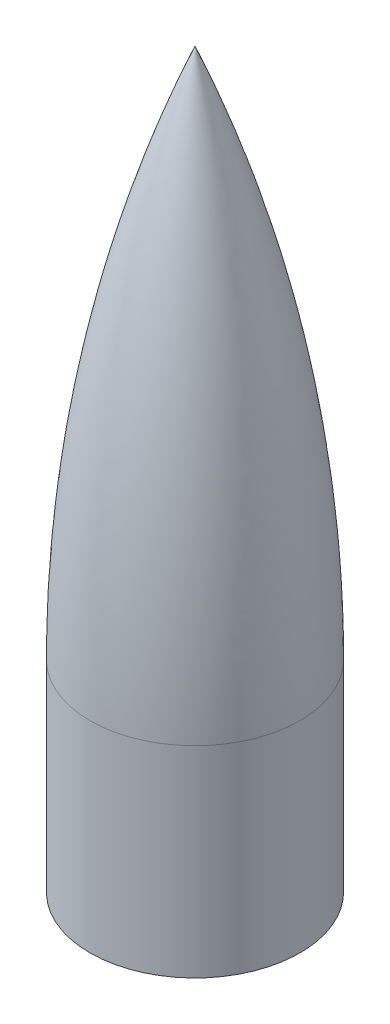
ISO-10303-21;
HEADER;
FILE_DESCRIPTION(('STEP AP214'),'2;1');
FILE_NAME('part.step','',(''),(''),'','','');
FILE_SCHEMA(('AUTOMOTIVE_DESIGN { 1 0 10303 214 1 1 1 1 }'));
ENDSEC;
DATA;
#1=APPLICATION_CONTEXT('core data for automotive mechanical design processes');
#2=APPLICATION_PROTOCOL_DEFINITION('international standard','automotive_design',2000,#1);
#3=PRODUCT_CONTEXT('',#1,'mechanical');
#4=PRODUCT('Part','Part','',(#3));
#5=PRODUCT_RELATED_PRODUCT_CATEGORY('part','',(#4));
#6=PRODUCT_DEFINITION_FORMATION('','',#4);
#7=PRODUCT_DEFINITION_CONTEXT('part definition',#1,'design');
#8=PRODUCT_DEFINITION('design','',#6,#7);
#9=PRODUCT_DEFINITION_SHAPE('','',#8);
#10=(LENGTH_UNIT() NAMED_UNIT(*) SI_UNIT(.MILLI.,.METRE.));
#11=(NAMED_UNIT(*) PLANE_ANGLE_UNIT() SI_UNIT($,.RADIAN.));
#12=(NAMED_UNIT(*) SI_UNIT($,.STERADIAN.) SOLID_ANGLE_UNIT());
#13=UNCERTAINTY_MEASURE_WITH_UNIT(LENGTH_MEASURE(1.E-05),#10,'distance_accuracy_value','');
#14=(GEOMETRIC_REPRESENTATION_CONTEXT(3) GLOBAL_UNCERTAINTY_ASSIGNED_CONTEXT((#13)) GLOBAL_UNIT_ASSIGNED_CONTEXT((#10,
#11,#12)) REPRESENTATION_CONTEXT('',''));
#15=CARTESIAN_POINT('',(0.,0.,0.));
#16=DIRECTION('',(0.,0.,1.));
#17=DIRECTION('',(1.,0.,0.));
#18=AXIS2_PLACEMENT_3D('',#15,#16,#17);
#19=CARTESIAN_POINT('',(0.,402.757656622288,0.));
#20=DIRECTION('',(0.,-1.,0.));
#21=DIRECTION('',(0.,0.,-1.));
#22=AXIS2_PLACEMENT_3D('',#19,#20,#21);
#23=CYLINDRICAL_SURFACE('',#22,78.35);
#24=CARTESIAN_POINT('',(0.,0.,0.));
#25=DIRECTION('',(0.,1.,0.));
#26=DIRECTION('',(0.,0.,1.));
#27=AXIS2_PLACEMENT_3D('',#24,#25,#26);
#28=CIRCLE('',#27,78.3499999999999);
#29=CARTESIAN_POINT('',(0.,0.,78.3499999999999));
#30=VERTEX_POINT('',#29);
#31=EDGE_CURVE('E11',#30,#30,#28,.T.);
#32=ORIENTED_EDGE('',*,*,#31,.F.);
#33=EDGE_LOOP('',(#32));
#34=FACE_BOUND('',#33,.T.);
#35=CARTESIAN_POINT('',(0.,-150.,0.));
#36=DIRECTION('',(0.,-1.,0.));
#37=DIRECTION('',(0.,0.,-1.));
#38=AXIS2_PLACEMENT_3D('',#35,#36,#37);
#39=CIRCLE('',#38,78.35);
#40=CARTESIAN_POINT('',(0.,-150.,-78.35));
#41=VERTEX_POINT('',#40);
#42=EDGE_CURVE('E42',#41,#41,#39,.T.);
#43=ORIENTED_EDGE('',*,*,#42,.F.);
#44=EDGE_LOOP('',(#43));
#45=FACE_BOUND('',#44,.T.);
#46=ADVANCED_FACE('F39',(#34,#45),#23,.T.);
#47=CARTESIAN_POINT('',(0.,-150.,0.));
#48=DIRECTION('',(0.,-1.,0.));
#49=DIRECTION('',(0.,0.,-1.));
#50=AXIS2_PLACEMENT_3D('',#47,#48,#49);
#51=PLANE('',#50);
#52=ORIENTED_EDGE('',*,*,#42,.T.);
#53=EDGE_LOOP('',(#52));
#54=FACE_BOUND('',#53,.T.);
#55=ADVANCED_FACE('F52',(#54),#51,.T.);
#56=CARTESIAN_POINT('',(0.,-1.11022302462516E-13,-964.039392901324));
#57=DIRECTION('',(-1.,0.,0.));
#58=DIRECTION('',(0.,0.,1.));
#59=AXIS2_PLACEMENT_3D('',#56,#57,#58);
#60=CIRCLE('',#59,1042.38939290132);
#61=TRIMMED_CURVE('',#60,(PARAMETER_VALUE(-0.390191728322816)),
(PARAMETER_VALUE(0.390191728322816)),.T.,.PARAMETER.);
#62=CARTESIAN_POINT('',(0.,-1.11022302462516E-13,0.));
#63=DIRECTION('',(0.,1.,0.));
#64=AXIS1_PLACEMENT('',#62,#63);
#65=SURFACE_OF_REVOLUTION('',#61,#64);
#66=CARTESIAN_POINT('',(-1.11022302462516E-13,396.489212170568,0.));
#67=VERTEX_POINT('',#66);
#68=VERTEX_LOOP('',#67);
#69=FACE_BOUND('',#68,.T.);
#70=ORIENTED_EDGE('',*,*,#31,.T.);
#71=EDGE_LOOP('',(#70));
#72=FACE_BOUND('',#71,.T.);
#73=ADVANCED_FACE('F49',(#69,#72),#65,.T.);
#74=CLOSED_SHELL('',(#46,#55,#73));
#75=MANIFOLD_SOLID_BREP('B2',#74);
#76=ADVANCED_BREP_SHAPE_REPRESENTATION('',(#18,#75),#14);
#77=SHAPE_DEFINITION_REPRESENTATION(#9,#76);
ENDSEC;
END-ISO-10303-21;
